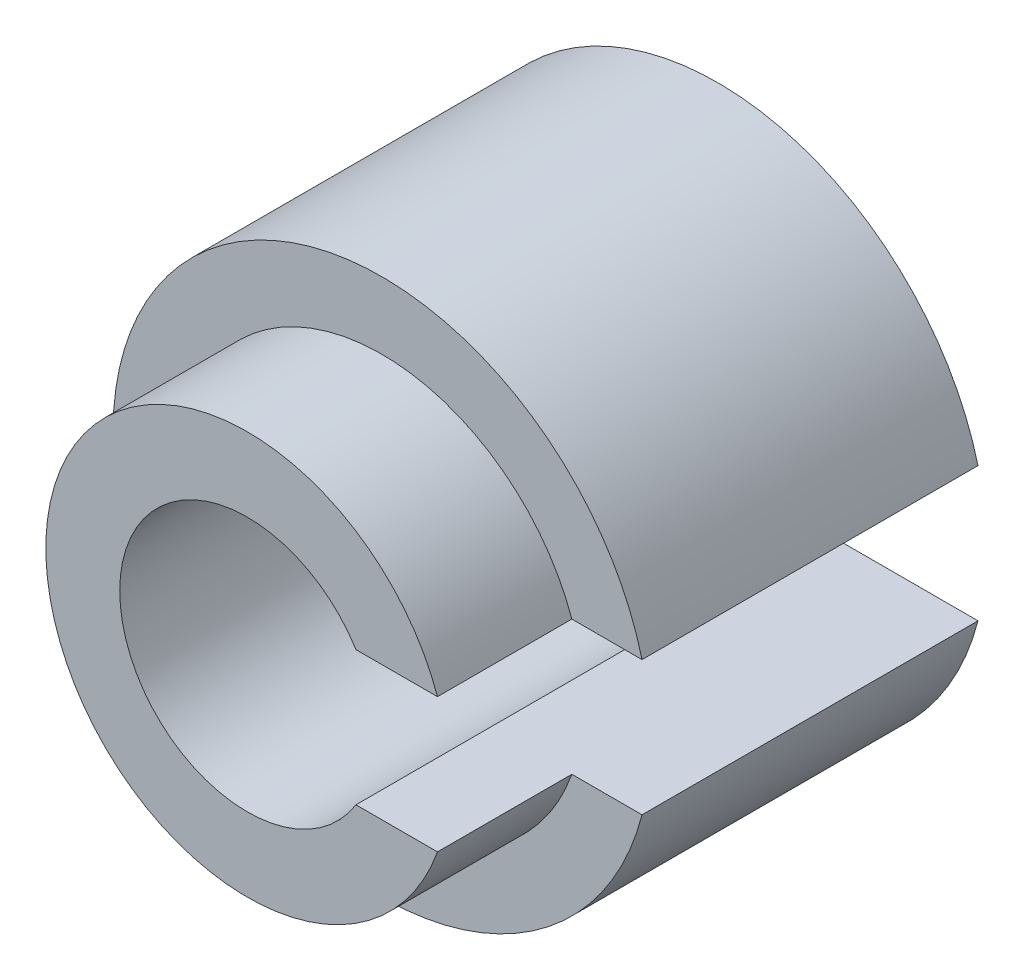
ISO-10303-21;
HEADER;
FILE_DESCRIPTION(('STEP AP214'),'2;1');
FILE_NAME('part.step','',(''),(''),'','','');
FILE_SCHEMA(('AUTOMOTIVE_DESIGN { 1 0 10303 214 1 1 1 1 }'));
ENDSEC;
DATA;
#1=APPLICATION_CONTEXT('core data for automotive mechanical design processes');
#2=APPLICATION_PROTOCOL_DEFINITION('international standard','automotive_design',2000,#1);
#3=PRODUCT_CONTEXT('',#1,'mechanical');
#4=PRODUCT('Part','Part','',(#3));
#5=PRODUCT_RELATED_PRODUCT_CATEGORY('part','',(#4));
#6=PRODUCT_DEFINITION_FORMATION('','',#4);
#7=PRODUCT_DEFINITION_CONTEXT('part definition',#1,'design');
#8=PRODUCT_DEFINITION('design','',#6,#7);
#9=PRODUCT_DEFINITION_SHAPE('','',#8);
#10=(LENGTH_UNIT() NAMED_UNIT(*) SI_UNIT(.MILLI.,.METRE.));
#11=(NAMED_UNIT(*) PLANE_ANGLE_UNIT() SI_UNIT($,.RADIAN.));
#12=(NAMED_UNIT(*) SI_UNIT($,.STERADIAN.) SOLID_ANGLE_UNIT());
#13=UNCERTAINTY_MEASURE_WITH_UNIT(LENGTH_MEASURE(1.E-05),#10,'distance_accuracy_value','');
#14=(GEOMETRIC_REPRESENTATION_CONTEXT(3) GLOBAL_UNCERTAINTY_ASSIGNED_CONTEXT((#13)) GLOBAL_UNIT_ASSIGNED_CONTEXT((#10,
#11,#12)) REPRESENTATION_CONTEXT('',''));
#15=CARTESIAN_POINT('',(0.,0.,0.));
#16=DIRECTION('',(0.,0.,1.));
#17=DIRECTION('',(1.,0.,0.));
#18=AXIS2_PLACEMENT_3D('',#15,#16,#17);
#19=CARTESIAN_POINT('',(0.,0.,5.));
#20=DIRECTION('',(0.,0.,1.));
#21=DIRECTION('',(1.,0.,0.));
#22=AXIS2_PLACEMENT_3D('',#19,#20,#21);
#23=PLANE('',#22);
#24=CARTESIAN_POINT('',(0.,0.,5.));
#25=DIRECTION('',(0.,0.,1.));
#26=DIRECTION('',(1.,0.,0.));
#27=AXIS2_PLACEMENT_3D('',#24,#25,#26);
#28=CIRCLE('',#27,4.);
#29=CARTESIAN_POINT('',(3.87298334620742,1.,5.));
#30=VERTEX_POINT('',#29);
#31=CARTESIAN_POINT('',(3.87298334620742,-1.,5.));
#32=VERTEX_POINT('',#31);
#33=EDGE_CURVE('E102',#30,#32,#28,.T.);
#34=ORIENTED_EDGE('',*,*,#33,.T.);
#35=DIRECTION('',(1.,0.,0.));
#36=VECTOR('',#35,1.);
#37=CARTESIAN_POINT('',(4.,-1.,5.));
#38=LINE('',#37,#36);
#39=CARTESIAN_POINT('',(2.82842712474619,-1.,5.));
#40=VERTEX_POINT('',#39);
#41=EDGE_CURVE('E128',#40,#32,#38,.T.);
#42=ORIENTED_EDGE('',*,*,#41,.F.);
#43=CARTESIAN_POINT('',(0.,0.,5.));
#44=DIRECTION('',(0.,0.,1.));
#45=DIRECTION('',(1.,0.,0.));
#46=AXIS2_PLACEMENT_3D('',#43,#44,#45);
#47=CIRCLE('',#46,3.);
#48=CARTESIAN_POINT('',(2.82842712474619,1.,5.));
#49=VERTEX_POINT('',#48);
#50=EDGE_CURVE('E104',#49,#40,#47,.T.);
#51=ORIENTED_EDGE('',*,*,#50,.F.);
#52=DIRECTION('',(1.,0.,0.));
#53=VECTOR('',#52,1.);
#54=CARTESIAN_POINT('',(4.,1.,5.));
#55=LINE('',#54,#53);
#56=EDGE_CURVE('E88',#49,#30,#55,.T.);
#57=ORIENTED_EDGE('',*,*,#56,.T.);
#58=EDGE_LOOP('',(#34,#42,#51,#57));
#59=FACE_BOUND('',#58,.T.);
#60=ADVANCED_FACE('F35',(#59),#23,.T.);
#61=CARTESIAN_POINT('',(0.,0.,5.));
#62=DIRECTION('',(0.,0.,-1.));
#63=DIRECTION('',(-1.,0.,0.));
#64=AXIS2_PLACEMENT_3D('',#61,#62,#63);
#65=CYLINDRICAL_SURFACE('',#64,4.);
#66=DIRECTION('',(0.,0.,-1.));
#67=VECTOR('',#66,1.);
#68=CARTESIAN_POINT('',(3.87298334620742,-1.,5.));
#69=LINE('',#68,#67);
#70=CARTESIAN_POINT('',(3.87298334620742,-1.,0.));
#71=VERTEX_POINT('',#70);
#72=EDGE_CURVE('E107',#32,#71,#69,.T.);
#73=ORIENTED_EDGE('',*,*,#72,.F.);
#74=ORIENTED_EDGE('',*,*,#33,.F.);
#75=DIRECTION('',(0.,0.,-1.));
#76=VECTOR('',#75,1.);
#77=CARTESIAN_POINT('',(3.87298334620742,1.,5.));
#78=LINE('',#77,#76);
#79=CARTESIAN_POINT('',(3.87298334620742,1.,0.));
#80=VERTEX_POINT('',#79);
#81=EDGE_CURVE('E85',#30,#80,#78,.T.);
#82=ORIENTED_EDGE('',*,*,#81,.T.);
#83=CARTESIAN_POINT('',(0.,0.,0.));
#84=DIRECTION('',(0.,0.,1.));
#85=DIRECTION('',(1.,0.,0.));
#86=AXIS2_PLACEMENT_3D('',#83,#84,#85);
#87=CIRCLE('',#86,4.);
#88=EDGE_CURVE('E108',#80,#71,#87,.T.);
#89=ORIENTED_EDGE('',*,*,#88,.T.);
#90=EDGE_LOOP('',(#73,#74,#82,#89));
#91=FACE_BOUND('',#90,.T.);
#92=ADVANCED_FACE('F37',(#91),#65,.T.);
#93=CARTESIAN_POINT('',(0.,0.,0.));
#94=DIRECTION('',(0.,0.,1.));
#95=DIRECTION('',(1.,0.,0.));
#96=AXIS2_PLACEMENT_3D('',#93,#94,#95);
#97=PLANE('',#96);
#98=DIRECTION('',(-1.,0.,0.));
#99=VECTOR('',#98,1.);
#100=CARTESIAN_POINT('',(0.,-1.,0.));
#101=LINE('',#100,#99);
#102=CARTESIAN_POINT('',(1.61554944214035,-1.,0.));
#103=VERTEX_POINT('',#102);
#104=EDGE_CURVE('E57',#71,#103,#101,.T.);
#105=ORIENTED_EDGE('',*,*,#104,.F.);
#106=ORIENTED_EDGE('',*,*,#88,.F.);
#107=DIRECTION('',(-1.,0.,0.));
#108=VECTOR('',#107,1.);
#109=CARTESIAN_POINT('',(0.,1.,0.));
#110=LINE('',#109,#108);
#111=CARTESIAN_POINT('',(1.61554944214035,1.,0.));
#112=VERTEX_POINT('',#111);
#113=EDGE_CURVE('E91',#80,#112,#110,.T.);
#114=ORIENTED_EDGE('',*,*,#113,.T.);
#115=CARTESIAN_POINT('',(0.,0.,0.));
#116=DIRECTION('',(0.,0.,1.));
#117=DIRECTION('',(1.,0.,0.));
#118=AXIS2_PLACEMENT_3D('',#115,#116,#117);
#119=CIRCLE('',#118,1.9);
#120=EDGE_CURVE('E114',#112,#103,#119,.T.);
#121=ORIENTED_EDGE('',*,*,#120,.T.);
#122=EDGE_LOOP('',(#105,#106,#114,#121));
#123=FACE_BOUND('',#122,.T.);
#124=ADVANCED_FACE('F145',(#123),#97,.F.);
#125=CARTESIAN_POINT('',(0.,0.,7.));
#126=DIRECTION('',(0.,0.,-1.));
#127=DIRECTION('',(-1.,0.,0.));
#128=AXIS2_PLACEMENT_3D('',#125,#126,#127);
#129=CYLINDRICAL_SURFACE('',#128,3.);
#130=DIRECTION('',(0.,0.,-1.));
#131=VECTOR('',#130,1.);
#132=CARTESIAN_POINT('',(2.82842712474619,-1.,7.));
#133=LINE('',#132,#131);
#134=CARTESIAN_POINT('',(2.82842712474619,-1.,7.));
#135=VERTEX_POINT('',#134);
#136=EDGE_CURVE('E96',#135,#40,#133,.T.);
#137=ORIENTED_EDGE('',*,*,#136,.F.);
#138=CARTESIAN_POINT('',(0.,0.,7.));
#139=DIRECTION('',(0.,0.,1.));
#140=DIRECTION('',(1.,0.,0.));
#141=AXIS2_PLACEMENT_3D('',#138,#139,#140);
#142=CIRCLE('',#141,3.);
#143=CARTESIAN_POINT('',(2.82842712474619,1.,7.));
#144=VERTEX_POINT('',#143);
#145=EDGE_CURVE('E110',#144,#135,#142,.T.);
#146=ORIENTED_EDGE('',*,*,#145,.F.);
#147=DIRECTION('',(0.,0.,-1.));
#148=VECTOR('',#147,1.);
#149=CARTESIAN_POINT('',(2.82842712474619,1.,7.));
#150=LINE('',#149,#148);
#151=EDGE_CURVE('E97',#144,#49,#150,.T.);
#152=ORIENTED_EDGE('',*,*,#151,.T.);
#153=ORIENTED_EDGE('',*,*,#50,.T.);
#154=EDGE_LOOP('',(#137,#146,#152,#153));
#155=FACE_BOUND('',#154,.T.);
#156=ADVANCED_FACE('F137',(#155),#129,.T.);
#157=CARTESIAN_POINT('',(0.,0.,7.));
#158=DIRECTION('',(0.,0.,1.));
#159=DIRECTION('',(1.,0.,0.));
#160=AXIS2_PLACEMENT_3D('',#157,#158,#159);
#161=PLANE('',#160);
#162=ORIENTED_EDGE('',*,*,#145,.T.);
#163=DIRECTION('',(1.,0.,0.));
#164=VECTOR('',#163,1.);
#165=CARTESIAN_POINT('',(3.,-1.,7.));
#166=LINE('',#165,#164);
#167=CARTESIAN_POINT('',(1.61554944214035,-1.,7.));
#168=VERTEX_POINT('',#167);
#169=EDGE_CURVE('E126',#168,#135,#166,.T.);
#170=ORIENTED_EDGE('',*,*,#169,.F.);
#171=CARTESIAN_POINT('',(0.,0.,7.));
#172=DIRECTION('',(0.,0.,1.));
#173=DIRECTION('',(1.,0.,0.));
#174=AXIS2_PLACEMENT_3D('',#171,#172,#173);
#175=CIRCLE('',#174,1.9);
#176=CARTESIAN_POINT('',(1.61554944214035,1.,7.));
#177=VERTEX_POINT('',#176);
#178=EDGE_CURVE('E117',#177,#168,#175,.T.);
#179=ORIENTED_EDGE('',*,*,#178,.F.);
#180=DIRECTION('',(1.,0.,0.));
#181=VECTOR('',#180,1.);
#182=CARTESIAN_POINT('',(3.,1.,7.));
#183=LINE('',#182,#181);
#184=EDGE_CURVE('E50',#177,#144,#183,.T.);
#185=ORIENTED_EDGE('',*,*,#184,.T.);
#186=EDGE_LOOP('',(#162,#170,#179,#185));
#187=FACE_BOUND('',#186,.T.);
#188=ADVANCED_FACE('F140',(#187),#161,.T.);
#189=CARTESIAN_POINT('',(0.,0.,0.));
#190=DIRECTION('',(0.,0.,1.));
#191=DIRECTION('',(1.,0.,0.));
#192=AXIS2_PLACEMENT_3D('',#189,#190,#191);
#193=CYLINDRICAL_SURFACE('',#192,1.9);
#194=DIRECTION('',(0.,0.,1.));
#195=VECTOR('',#194,1.);
#196=CARTESIAN_POINT('',(1.61554944214035,-1.,0.));
#197=LINE('',#196,#195);
#198=EDGE_CURVE('E11',#103,#168,#197,.T.);
#199=ORIENTED_EDGE('',*,*,#198,.F.);
#200=ORIENTED_EDGE('',*,*,#120,.F.);
#201=DIRECTION('',(0.,0.,1.));
#202=VECTOR('',#201,1.);
#203=CARTESIAN_POINT('',(1.61554944214035,1.,0.));
#204=LINE('',#203,#202);
#205=EDGE_CURVE('E43',#112,#177,#204,.T.);
#206=ORIENTED_EDGE('',*,*,#205,.T.);
#207=ORIENTED_EDGE('',*,*,#178,.T.);
#208=EDGE_LOOP('',(#199,#200,#206,#207));
#209=FACE_BOUND('',#208,.T.);
#210=ADVANCED_FACE('F142',(#209),#193,.F.);
#211=CARTESIAN_POINT('',(0.,1.,0.));
#212=DIRECTION('',(0.,1.,0.));
#213=DIRECTION('',(0.,0.,1.));
#214=AXIS2_PLACEMENT_3D('',#211,#212,#213);
#215=PLANE('',#214);
#216=ORIENTED_EDGE('',*,*,#56,.F.);
#217=ORIENTED_EDGE('',*,*,#151,.F.);
#218=ORIENTED_EDGE('',*,*,#184,.F.);
#219=ORIENTED_EDGE('',*,*,#205,.F.);
#220=ORIENTED_EDGE('',*,*,#113,.F.);
#221=ORIENTED_EDGE('',*,*,#81,.F.);
#222=EDGE_LOOP('',(#216,#217,#218,#219,#220,#221));
#223=FACE_BOUND('',#222,.T.);
#224=ADVANCED_FACE('F87',(#223),#215,.F.);
#225=CARTESIAN_POINT('',(0.,-1.,0.));
#226=DIRECTION('',(0.,1.,0.));
#227=DIRECTION('',(0.,0.,1.));
#228=AXIS2_PLACEMENT_3D('',#225,#226,#227);
#229=PLANE('',#228);
#230=ORIENTED_EDGE('',*,*,#72,.T.);
#231=ORIENTED_EDGE('',*,*,#104,.T.);
#232=ORIENTED_EDGE('',*,*,#198,.T.);
#233=ORIENTED_EDGE('',*,*,#169,.T.);
#234=ORIENTED_EDGE('',*,*,#136,.T.);
#235=ORIENTED_EDGE('',*,*,#41,.T.);
#236=EDGE_LOOP('',(#230,#231,#232,#233,#234,#235));
#237=FACE_BOUND('',#236,.T.);
#238=ADVANCED_FACE('F132',(#237),#229,.T.);
#239=CLOSED_SHELL('',(#60,#92,#124,#156,#188,#210,#224,#238));
#240=MANIFOLD_SOLID_BREP('B2',#239);
#241=ADVANCED_BREP_SHAPE_REPRESENTATION('',(#18,#240),#14);
#242=SHAPE_DEFINITION_REPRESENTATION(#9,#241);
ENDSEC;
END-ISO-10303-21;
